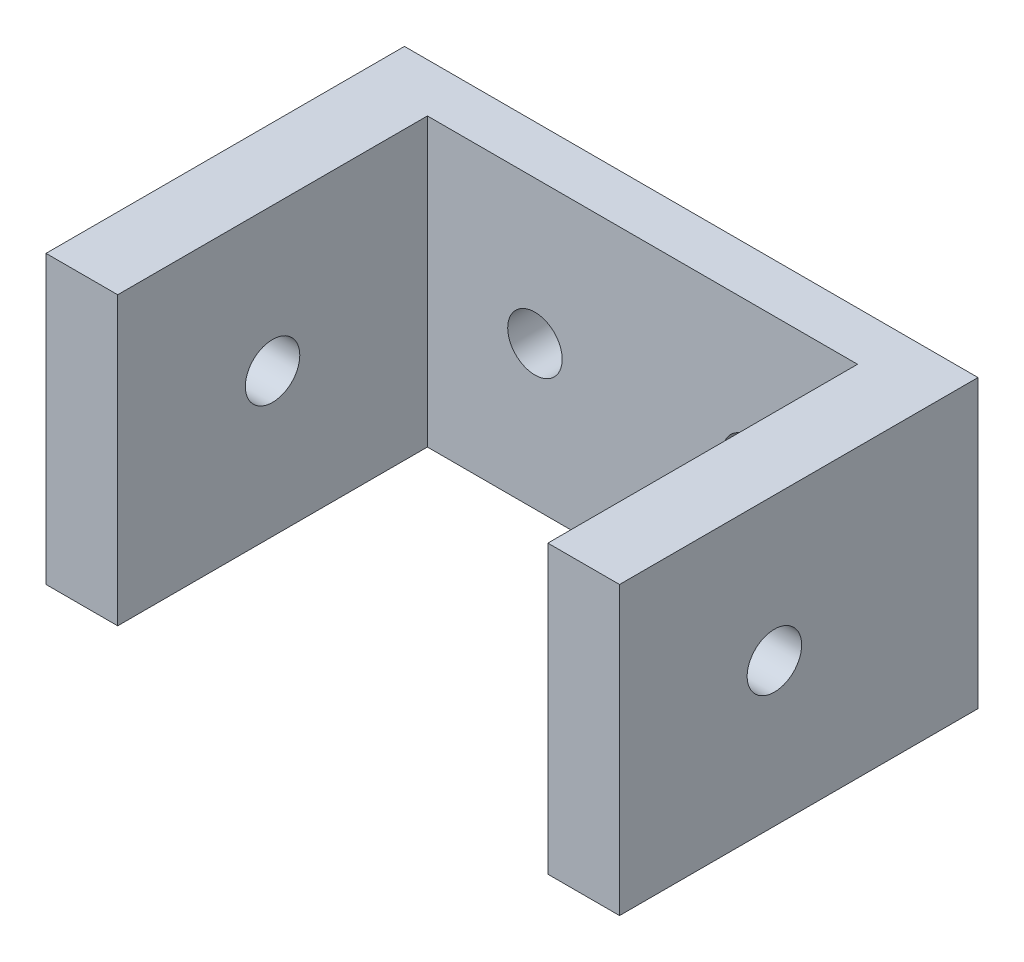
ISO-10303-21;
HEADER;
FILE_DESCRIPTION(('STEP AP214'),'2;1');
FILE_NAME('part.step','',(''),(''),'','','');
FILE_SCHEMA(('AUTOMOTIVE_DESIGN { 1 0 10303 214 1 1 1 1 }'));
ENDSEC;
DATA;
#1=APPLICATION_CONTEXT('core data for automotive mechanical design processes');
#2=APPLICATION_PROTOCOL_DEFINITION('international standard','automotive_design',2000,#1);
#3=PRODUCT_CONTEXT('',#1,'mechanical');
#4=PRODUCT('Part','Part','',(#3));
#5=PRODUCT_RELATED_PRODUCT_CATEGORY('part','',(#4));
#6=PRODUCT_DEFINITION_FORMATION('','',#4);
#7=PRODUCT_DEFINITION_CONTEXT('part definition',#1,'design');
#8=PRODUCT_DEFINITION('design','',#6,#7);
#9=PRODUCT_DEFINITION_SHAPE('','',#8);
#10=(LENGTH_UNIT() NAMED_UNIT(*) SI_UNIT(.MILLI.,.METRE.));
#11=(NAMED_UNIT(*) PLANE_ANGLE_UNIT() SI_UNIT($,.RADIAN.));
#12=(NAMED_UNIT(*) SI_UNIT($,.STERADIAN.) SOLID_ANGLE_UNIT());
#13=UNCERTAINTY_MEASURE_WITH_UNIT(LENGTH_MEASURE(1.E-05),#10,'distance_accuracy_value','');
#14=(GEOMETRIC_REPRESENTATION_CONTEXT(3) GLOBAL_UNCERTAINTY_ASSIGNED_CONTEXT((#13)) GLOBAL_UNIT_ASSIGNED_CONTEXT((#10,
#11,#12)) REPRESENTATION_CONTEXT('',''));
#15=CARTESIAN_POINT('',(0.,0.,0.));
#16=DIRECTION('',(0.,0.,1.));
#17=DIRECTION('',(1.,0.,0.));
#18=AXIS2_PLACEMENT_3D('',#15,#16,#17);
#19=CARTESIAN_POINT('',(0.,0.,4.318));
#20=DIRECTION('',(0.,0.,-1.));
#21=DIRECTION('',(-1.,0.,0.));
#22=AXIS2_PLACEMENT_3D('',#19,#20,#21);
#23=PLANE('',#22);
#24=CARTESIAN_POINT('',(9.525,0.,4.318));
#25=DIRECTION('',(0.,0.,-1.));
#26=DIRECTION('',(-1.,0.,0.));
#27=AXIS2_PLACEMENT_3D('',#24,#25,#26);
#28=CIRCLE('',#27,2.413);
#29=CARTESIAN_POINT('',(7.112,0.,4.318));
#30=VERTEX_POINT('',#29);
#31=EDGE_CURVE('E124',#30,#30,#28,.T.);
#32=ORIENTED_EDGE('',*,*,#31,.T.);
#33=EDGE_LOOP('',(#32));
#34=FACE_BOUND('',#33,.T.);
#35=CARTESIAN_POINT('',(-9.525,0.,4.318));
#36=DIRECTION('',(0.,0.,-1.));
#37=DIRECTION('',(-1.,0.,0.));
#38=AXIS2_PLACEMENT_3D('',#35,#36,#37);
#39=CIRCLE('',#38,2.413);
#40=CARTESIAN_POINT('',(-11.938,0.,4.318));
#41=VERTEX_POINT('',#40);
#42=EDGE_CURVE('E285',#41,#41,#39,.T.);
#43=ORIENTED_EDGE('',*,*,#42,.T.);
#44=EDGE_LOOP('',(#43));
#45=FACE_BOUND('',#44,.T.);
#46=DIRECTION('',(0.,-1.,0.));
#47=VECTOR('',#46,1.);
#48=CARTESIAN_POINT('',(19.05,12.7,4.318));
#49=LINE('',#48,#47);
#50=CARTESIAN_POINT('',(19.05,12.7,4.318));
#51=VERTEX_POINT('',#50);
#52=CARTESIAN_POINT('',(19.05,-12.7,4.318));
#53=VERTEX_POINT('',#52);
#54=EDGE_CURVE('E55',#51,#53,#49,.T.);
#55=ORIENTED_EDGE('',*,*,#54,.F.);
#56=DIRECTION('',(-1.,0.,0.));
#57=VECTOR('',#56,1.);
#58=CARTESIAN_POINT('',(-25.4,12.7,4.318));
#59=LINE('',#58,#57);
#60=CARTESIAN_POINT('',(-19.05,12.7,4.318));
#61=VERTEX_POINT('',#60);
#62=EDGE_CURVE('E155',#51,#61,#59,.T.);
#63=ORIENTED_EDGE('',*,*,#62,.T.);
#64=DIRECTION('',(0.,1.,0.));
#65=VECTOR('',#64,1.);
#66=CARTESIAN_POINT('',(-19.05,12.7,4.318));
#67=LINE('',#66,#65);
#68=CARTESIAN_POINT('',(-19.05,-12.7,4.318));
#69=VERTEX_POINT('',#68);
#70=EDGE_CURVE('E136',#69,#61,#67,.T.);
#71=ORIENTED_EDGE('',*,*,#70,.F.);
#72=DIRECTION('',(1.,0.,0.));
#73=VECTOR('',#72,1.);
#74=CARTESIAN_POINT('',(-25.4,-12.7,4.318));
#75=LINE('',#74,#73);
#76=EDGE_CURVE('E60',#69,#53,#75,.T.);
#77=ORIENTED_EDGE('',*,*,#76,.T.);
#78=EDGE_LOOP('',(#55,#63,#71,#77));
#79=FACE_BOUND('',#78,.T.);
#80=ADVANCED_FACE('F39',(#34,#45,#79),#23,.F.);
#81=CARTESIAN_POINT('',(25.4,-12.7,4.318));
#82=DIRECTION('',(-1.,0.,0.));
#83=DIRECTION('',(0.,0.,1.));
#84=AXIS2_PLACEMENT_3D('',#81,#82,#83);
#85=PLANE('',#84);
#86=CARTESIAN_POINT('',(25.4,0.,18.034));
#87=DIRECTION('',(1.,0.,0.));
#88=DIRECTION('',(0.,0.,-1.));
#89=AXIS2_PLACEMENT_3D('',#86,#87,#88);
#90=CIRCLE('',#89,2.413);
#91=CARTESIAN_POINT('',(25.4,0.,15.621));
#92=VERTEX_POINT('',#91);
#93=EDGE_CURVE('E300',#92,#92,#90,.T.);
#94=ORIENTED_EDGE('',*,*,#93,.F.);
#95=EDGE_LOOP('',(#94));
#96=FACE_BOUND('',#95,.T.);
#97=DIRECTION('',(0.,1.,0.));
#98=VECTOR('',#97,1.);
#99=CARTESIAN_POINT('',(25.4,-12.7,0.));
#100=LINE('',#99,#98);
#101=CARTESIAN_POINT('',(25.4,-12.7,0.));
#102=VERTEX_POINT('',#101);
#103=CARTESIAN_POINT('',(25.4,12.7,0.));
#104=VERTEX_POINT('',#103);
#105=EDGE_CURVE('E108',#102,#104,#100,.T.);
#106=ORIENTED_EDGE('',*,*,#105,.T.);
#107=DIRECTION('',(0.,0.,-1.));
#108=VECTOR('',#107,1.);
#109=CARTESIAN_POINT('',(25.4,12.7,4.318));
#110=LINE('',#109,#108);
#111=CARTESIAN_POINT('',(25.4,12.7,31.75));
#112=VERTEX_POINT('',#111);
#113=EDGE_CURVE('E11',#112,#104,#110,.T.);
#114=ORIENTED_EDGE('',*,*,#113,.F.);
#115=DIRECTION('',(0.,1.,0.));
#116=VECTOR('',#115,1.);
#117=CARTESIAN_POINT('',(25.4,12.7,31.75));
#118=LINE('',#117,#116);
#119=CARTESIAN_POINT('',(25.4,-12.7,31.75));
#120=VERTEX_POINT('',#119);
#121=EDGE_CURVE('E106',#120,#112,#118,.T.);
#122=ORIENTED_EDGE('',*,*,#121,.F.);
#123=DIRECTION('',(0.,0.,-1.));
#124=VECTOR('',#123,1.);
#125=CARTESIAN_POINT('',(25.4,-12.7,4.318));
#126=LINE('',#125,#124);
#127=EDGE_CURVE('E159',#120,#102,#126,.T.);
#128=ORIENTED_EDGE('',*,*,#127,.T.);
#129=EDGE_LOOP('',(#106,#114,#122,#128));
#130=FACE_BOUND('',#129,.T.);
#131=ADVANCED_FACE('F41',(#96,#130),#85,.F.);
#132=CARTESIAN_POINT('',(-25.4,12.7,4.318));
#133=DIRECTION('',(0.,-1.,0.));
#134=DIRECTION('',(0.,0.,-1.));
#135=AXIS2_PLACEMENT_3D('',#132,#133,#134);
#136=PLANE('',#135);
#137=DIRECTION('',(-1.,0.,0.));
#138=VECTOR('',#137,1.);
#139=CARTESIAN_POINT('',(-25.4,12.7,0.));
#140=LINE('',#139,#138);
#141=CARTESIAN_POINT('',(-25.4,12.7,0.));
#142=VERTEX_POINT('',#141);
#143=EDGE_CURVE('E161',#104,#142,#140,.T.);
#144=ORIENTED_EDGE('',*,*,#143,.T.);
#145=DIRECTION('',(0.,0.,-1.));
#146=VECTOR('',#145,1.);
#147=CARTESIAN_POINT('',(-25.4,12.7,4.318));
#148=LINE('',#147,#146);
#149=CARTESIAN_POINT('',(-25.4,12.7,31.75));
#150=VERTEX_POINT('',#149);
#151=EDGE_CURVE('E48',#150,#142,#148,.T.);
#152=ORIENTED_EDGE('',*,*,#151,.F.);
#153=DIRECTION('',(-1.,0.,0.));
#154=VECTOR('',#153,1.);
#155=CARTESIAN_POINT('',(-25.4,12.7,31.75));
#156=LINE('',#155,#154);
#157=CARTESIAN_POINT('',(-19.05,12.7,31.75));
#158=VERTEX_POINT('',#157);
#159=EDGE_CURVE('E144',#158,#150,#156,.T.);
#160=ORIENTED_EDGE('',*,*,#159,.F.);
#161=DIRECTION('',(0.,0.,-1.));
#162=VECTOR('',#161,1.);
#163=CARTESIAN_POINT('',(-19.05,12.7,31.75));
#164=LINE('',#163,#162);
#165=EDGE_CURVE('E147',#158,#61,#164,.T.);
#166=ORIENTED_EDGE('',*,*,#165,.T.);
#167=ORIENTED_EDGE('',*,*,#62,.F.);
#168=DIRECTION('',(0.,0.,-1.));
#169=VECTOR('',#168,1.);
#170=CARTESIAN_POINT('',(19.05,12.7,31.75));
#171=LINE('',#170,#169);
#172=CARTESIAN_POINT('',(19.05,12.7,31.75));
#173=VERTEX_POINT('',#172);
#174=EDGE_CURVE('E114',#173,#51,#171,.T.);
#175=ORIENTED_EDGE('',*,*,#174,.F.);
#176=DIRECTION('',(-1.,0.,0.));
#177=VECTOR('',#176,1.);
#178=CARTESIAN_POINT('',(25.4,12.7,31.75));
#179=LINE('',#178,#177);
#180=EDGE_CURVE('E111',#112,#173,#179,.T.);
#181=ORIENTED_EDGE('',*,*,#180,.F.);
#182=ORIENTED_EDGE('',*,*,#113,.T.);
#183=EDGE_LOOP('',(#144,#152,#160,#166,#167,#175,#181,#182));
#184=FACE_BOUND('',#183,.T.);
#185=ADVANCED_FACE('F112',(#184),#136,.F.);
#186=CARTESIAN_POINT('',(-25.4,-12.7,4.318));
#187=DIRECTION('',(1.,0.,0.));
#188=DIRECTION('',(0.,0.,-1.));
#189=AXIS2_PLACEMENT_3D('',#186,#187,#188);
#190=PLANE('',#189);
#191=CARTESIAN_POINT('',(-25.4,0.,18.034));
#192=DIRECTION('',(1.,0.,0.));
#193=DIRECTION('',(0.,0.,-1.));
#194=AXIS2_PLACEMENT_3D('',#191,#192,#193);
#195=CIRCLE('',#194,2.413);
#196=CARTESIAN_POINT('',(-25.4,0.,15.621));
#197=VERTEX_POINT('',#196);
#198=EDGE_CURVE('E278',#197,#197,#195,.T.);
#199=ORIENTED_EDGE('',*,*,#198,.T.);
#200=EDGE_LOOP('',(#199));
#201=FACE_BOUND('',#200,.T.);
#202=DIRECTION('',(0.,-1.,0.));
#203=VECTOR('',#202,1.);
#204=CARTESIAN_POINT('',(-25.4,-12.7,0.));
#205=LINE('',#204,#203);
#206=CARTESIAN_POINT('',(-25.4,-12.7,0.));
#207=VERTEX_POINT('',#206);
#208=EDGE_CURVE('E163',#142,#207,#205,.T.);
#209=ORIENTED_EDGE('',*,*,#208,.T.);
#210=DIRECTION('',(0.,0.,-1.));
#211=VECTOR('',#210,1.);
#212=CARTESIAN_POINT('',(-25.4,-12.7,4.318));
#213=LINE('',#212,#211);
#214=CARTESIAN_POINT('',(-25.4,-12.7,31.75));
#215=VERTEX_POINT('',#214);
#216=EDGE_CURVE('E167',#215,#207,#213,.T.);
#217=ORIENTED_EDGE('',*,*,#216,.F.);
#218=DIRECTION('',(0.,-1.,0.));
#219=VECTOR('',#218,1.);
#220=CARTESIAN_POINT('',(-25.4,12.7,31.75));
#221=LINE('',#220,#219);
#222=EDGE_CURVE('E137',#150,#215,#221,.T.);
#223=ORIENTED_EDGE('',*,*,#222,.F.);
#224=ORIENTED_EDGE('',*,*,#151,.T.);
#225=EDGE_LOOP('',(#209,#217,#223,#224));
#226=FACE_BOUND('',#225,.T.);
#227=ADVANCED_FACE('F174',(#201,#226),#190,.F.);
#228=CARTESIAN_POINT('',(-25.4,-12.7,4.318));
#229=DIRECTION('',(0.,1.,0.));
#230=DIRECTION('',(0.,0.,1.));
#231=AXIS2_PLACEMENT_3D('',#228,#229,#230);
#232=PLANE('',#231);
#233=DIRECTION('',(1.,0.,0.));
#234=VECTOR('',#233,1.);
#235=CARTESIAN_POINT('',(-25.4,-12.7,0.));
#236=LINE('',#235,#234);
#237=EDGE_CURVE('E157',#207,#102,#236,.T.);
#238=ORIENTED_EDGE('',*,*,#237,.T.);
#239=ORIENTED_EDGE('',*,*,#127,.F.);
#240=DIRECTION('',(1.,0.,0.));
#241=VECTOR('',#240,1.);
#242=CARTESIAN_POINT('',(25.4,-12.7,31.75));
#243=LINE('',#242,#241);
#244=CARTESIAN_POINT('',(19.05,-12.7,31.75));
#245=VERTEX_POINT('',#244);
#246=EDGE_CURVE('E122',#245,#120,#243,.T.);
#247=ORIENTED_EDGE('',*,*,#246,.F.);
#248=DIRECTION('',(0.,0.,-1.));
#249=VECTOR('',#248,1.);
#250=CARTESIAN_POINT('',(19.05,-12.7,31.75));
#251=LINE('',#250,#249);
#252=EDGE_CURVE('E131',#245,#53,#251,.T.);
#253=ORIENTED_EDGE('',*,*,#252,.T.);
#254=ORIENTED_EDGE('',*,*,#76,.F.);
#255=DIRECTION('',(0.,0.,-1.));
#256=VECTOR('',#255,1.);
#257=CARTESIAN_POINT('',(-19.05,-12.7,31.75));
#258=LINE('',#257,#256);
#259=CARTESIAN_POINT('',(-19.05,-12.7,31.75));
#260=VERTEX_POINT('',#259);
#261=EDGE_CURVE('E152',#260,#69,#258,.T.);
#262=ORIENTED_EDGE('',*,*,#261,.F.);
#263=DIRECTION('',(1.,0.,0.));
#264=VECTOR('',#263,1.);
#265=CARTESIAN_POINT('',(-25.4,-12.7,31.75));
#266=LINE('',#265,#264);
#267=EDGE_CURVE('E140',#215,#260,#266,.T.);
#268=ORIENTED_EDGE('',*,*,#267,.F.);
#269=ORIENTED_EDGE('',*,*,#216,.T.);
#270=EDGE_LOOP('',(#238,#239,#247,#253,#254,#262,#268,#269));
#271=FACE_BOUND('',#270,.T.);
#272=ADVANCED_FACE('F180',(#271),#232,.F.);
#273=CARTESIAN_POINT('',(0.,0.,0.));
#274=DIRECTION('',(0.,0.,-1.));
#275=DIRECTION('',(-1.,0.,0.));
#276=AXIS2_PLACEMENT_3D('',#273,#274,#275);
#277=PLANE('',#276);
#278=CARTESIAN_POINT('',(9.525,0.,0.));
#279=DIRECTION('',(0.,0.,-1.));
#280=DIRECTION('',(-1.,0.,0.));
#281=AXIS2_PLACEMENT_3D('',#278,#279,#280);
#282=CIRCLE('',#281,2.413);
#283=CARTESIAN_POINT('',(7.112,0.,0.));
#284=VERTEX_POINT('',#283);
#285=EDGE_CURVE('E290',#284,#284,#282,.T.);
#286=ORIENTED_EDGE('',*,*,#285,.F.);
#287=EDGE_LOOP('',(#286));
#288=FACE_BOUND('',#287,.T.);
#289=CARTESIAN_POINT('',(-9.525,0.,0.));
#290=DIRECTION('',(0.,0.,-1.));
#291=DIRECTION('',(-1.,0.,0.));
#292=AXIS2_PLACEMENT_3D('',#289,#290,#291);
#293=CIRCLE('',#292,2.413);
#294=CARTESIAN_POINT('',(-11.938,0.,0.));
#295=VERTEX_POINT('',#294);
#296=EDGE_CURVE('E127',#295,#295,#293,.T.);
#297=ORIENTED_EDGE('',*,*,#296,.F.);
#298=EDGE_LOOP('',(#297));
#299=FACE_BOUND('',#298,.T.);
#300=ORIENTED_EDGE('',*,*,#105,.F.);
#301=ORIENTED_EDGE('',*,*,#237,.F.);
#302=ORIENTED_EDGE('',*,*,#208,.F.);
#303=ORIENTED_EDGE('',*,*,#143,.F.);
#304=EDGE_LOOP('',(#300,#301,#302,#303));
#305=FACE_BOUND('',#304,.T.);
#306=ADVANCED_FACE('F178',(#288,#299,#305),#277,.T.);
#307=CARTESIAN_POINT('',(-19.05,12.7,31.75));
#308=DIRECTION('',(-1.,0.,0.));
#309=DIRECTION('',(0.,0.,1.));
#310=AXIS2_PLACEMENT_3D('',#307,#308,#309);
#311=PLANE('',#310);
#312=CARTESIAN_POINT('',(-19.05,0.,18.034));
#313=DIRECTION('',(-1.,0.,0.));
#314=DIRECTION('',(0.,0.,1.));
#315=AXIS2_PLACEMENT_3D('',#312,#313,#314);
#316=CIRCLE('',#315,2.413);
#317=CARTESIAN_POINT('',(-19.05,0.,20.447));
#318=VERTEX_POINT('',#317);
#319=EDGE_CURVE('E281',#318,#318,#316,.T.);
#320=ORIENTED_EDGE('',*,*,#319,.T.);
#321=EDGE_LOOP('',(#320));
#322=FACE_BOUND('',#321,.T.);
#323=ORIENTED_EDGE('',*,*,#70,.T.);
#324=ORIENTED_EDGE('',*,*,#165,.F.);
#325=DIRECTION('',(0.,1.,0.));
#326=VECTOR('',#325,1.);
#327=CARTESIAN_POINT('',(-19.05,12.7,31.75));
#328=LINE('',#327,#326);
#329=EDGE_CURVE('E142',#260,#158,#328,.T.);
#330=ORIENTED_EDGE('',*,*,#329,.F.);
#331=ORIENTED_EDGE('',*,*,#261,.T.);
#332=EDGE_LOOP('',(#323,#324,#330,#331));
#333=FACE_BOUND('',#332,.T.);
#334=ADVANCED_FACE('F188',(#322,#333),#311,.F.);
#335=CARTESIAN_POINT('',(0.,0.,31.75));
#336=DIRECTION('',(0.,0.,1.));
#337=DIRECTION('',(1.,0.,0.));
#338=AXIS2_PLACEMENT_3D('',#335,#336,#337);
#339=PLANE('',#338);
#340=ORIENTED_EDGE('',*,*,#222,.T.);
#341=ORIENTED_EDGE('',*,*,#267,.T.);
#342=ORIENTED_EDGE('',*,*,#329,.T.);
#343=ORIENTED_EDGE('',*,*,#159,.T.);
#344=EDGE_LOOP('',(#340,#341,#342,#343));
#345=FACE_BOUND('',#344,.T.);
#346=ADVANCED_FACE('F185',(#345),#339,.T.);
#347=CARTESIAN_POINT('',(19.05,12.7,31.75));
#348=DIRECTION('',(1.,0.,0.));
#349=DIRECTION('',(0.,0.,-1.));
#350=AXIS2_PLACEMENT_3D('',#347,#348,#349);
#351=PLANE('',#350);
#352=CARTESIAN_POINT('',(19.05,0.,18.034));
#353=DIRECTION('',(1.,0.,0.));
#354=DIRECTION('',(0.,0.,-1.));
#355=AXIS2_PLACEMENT_3D('',#352,#353,#354);
#356=CIRCLE('',#355,2.413);
#357=CARTESIAN_POINT('',(19.05,0.,15.621));
#358=VERTEX_POINT('',#357);
#359=EDGE_CURVE('E43',#358,#358,#356,.T.);
#360=ORIENTED_EDGE('',*,*,#359,.T.);
#361=EDGE_LOOP('',(#360));
#362=FACE_BOUND('',#361,.T.);
#363=ORIENTED_EDGE('',*,*,#54,.T.);
#364=ORIENTED_EDGE('',*,*,#252,.F.);
#365=DIRECTION('',(0.,-1.,0.));
#366=VECTOR('',#365,1.);
#367=CARTESIAN_POINT('',(19.05,12.7,31.75));
#368=LINE('',#367,#366);
#369=EDGE_CURVE('E117',#173,#245,#368,.T.);
#370=ORIENTED_EDGE('',*,*,#369,.F.);
#371=ORIENTED_EDGE('',*,*,#174,.T.);
#372=EDGE_LOOP('',(#363,#364,#370,#371));
#373=FACE_BOUND('',#372,.T.);
#374=ADVANCED_FACE('F191',(#362,#373),#351,.F.);
#375=CARTESIAN_POINT('',(0.,0.,31.75));
#376=DIRECTION('',(0.,0.,-1.));
#377=DIRECTION('',(-1.,0.,0.));
#378=AXIS2_PLACEMENT_3D('',#375,#376,#377);
#379=PLANE('',#378);
#380=ORIENTED_EDGE('',*,*,#121,.T.);
#381=ORIENTED_EDGE('',*,*,#180,.T.);
#382=ORIENTED_EDGE('',*,*,#369,.T.);
#383=ORIENTED_EDGE('',*,*,#246,.T.);
#384=EDGE_LOOP('',(#380,#381,#382,#383));
#385=FACE_BOUND('',#384,.T.);
#386=ADVANCED_FACE('F120',(#385),#379,.F.);
#387=CARTESIAN_POINT('',(-9.525,0.,4.318));
#388=DIRECTION('',(0.,0.,-1.));
#389=DIRECTION('',(-1.,0.,0.));
#390=AXIS2_PLACEMENT_3D('',#387,#388,#389);
#391=CYLINDRICAL_SURFACE('',#390,2.413);
#392=ORIENTED_EDGE('',*,*,#42,.F.);
#393=EDGE_LOOP('',(#392));
#394=FACE_BOUND('',#393,.T.);
#395=ORIENTED_EDGE('',*,*,#296,.T.);
#396=EDGE_LOOP('',(#395));
#397=FACE_BOUND('',#396,.T.);
#398=ADVANCED_FACE('F200',(#394,#397),#391,.F.);
#399=CARTESIAN_POINT('',(9.525,0.,4.318));
#400=DIRECTION('',(0.,0.,-1.));
#401=DIRECTION('',(-1.,0.,0.));
#402=AXIS2_PLACEMENT_3D('',#399,#400,#401);
#403=CYLINDRICAL_SURFACE('',#402,2.413);
#404=ORIENTED_EDGE('',*,*,#31,.F.);
#405=EDGE_LOOP('',(#404));
#406=FACE_BOUND('',#405,.T.);
#407=ORIENTED_EDGE('',*,*,#285,.T.);
#408=EDGE_LOOP('',(#407));
#409=FACE_BOUND('',#408,.T.);
#410=ADVANCED_FACE('F251',(#406,#409),#403,.F.);
#411=CARTESIAN_POINT('',(-25.4,0.,18.034));
#412=DIRECTION('',(1.,0.,0.));
#413=DIRECTION('',(0.,0.,-1.));
#414=AXIS2_PLACEMENT_3D('',#411,#412,#413);
#415=CYLINDRICAL_SURFACE('',#414,2.413);
#416=ORIENTED_EDGE('',*,*,#93,.T.);
#417=EDGE_LOOP('',(#416));
#418=FACE_BOUND('',#417,.T.);
#419=ORIENTED_EDGE('',*,*,#359,.F.);
#420=EDGE_LOOP('',(#419));
#421=FACE_BOUND('',#420,.T.);
#422=ADVANCED_FACE('F259',(#418,#421),#415,.F.);
#423=ORIENTED_EDGE('',*,*,#198,.F.);
#424=EDGE_LOOP('',(#423));
#425=FACE_BOUND('',#424,.T.);
#426=ORIENTED_EDGE('',*,*,#319,.F.);
#427=EDGE_LOOP('',(#426));
#428=FACE_BOUND('',#427,.T.);
#429=ADVANCED_FACE('F266',(#425,#428),#415,.F.);
#430=CLOSED_SHELL('',(#80,#131,#185,#227,#272,#306,#334,#346,#374,#386,#398,#410,#422,#429));
#431=MANIFOLD_SOLID_BREP('B2',#430);
#432=ADVANCED_BREP_SHAPE_REPRESENTATION('',(#18,#431),#14);
#433=SHAPE_DEFINITION_REPRESENTATION(#9,#432);
ENDSEC;
END-ISO-10303-21;
